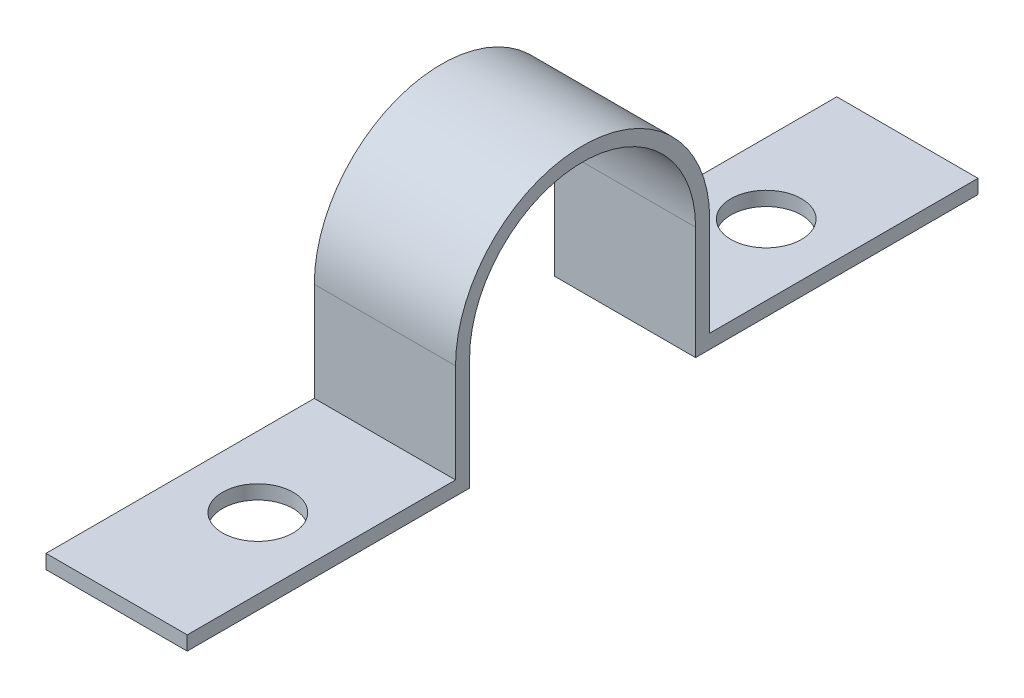
ISO-10303-21;
HEADER;
FILE_DESCRIPTION(('STEP AP214'),'2;1');
FILE_NAME('part.step','',(''),(''),'','','');
FILE_SCHEMA(('AUTOMOTIVE_DESIGN { 1 0 10303 214 1 1 1 1 }'));
ENDSEC;
DATA;
#1=APPLICATION_CONTEXT('core data for automotive mechanical design processes');
#2=APPLICATION_PROTOCOL_DEFINITION('international standard','automotive_design',2000,#1);
#3=PRODUCT_CONTEXT('',#1,'mechanical');
#4=PRODUCT('Part','Part','',(#3));
#5=PRODUCT_RELATED_PRODUCT_CATEGORY('part','',(#4));
#6=PRODUCT_DEFINITION_FORMATION('','',#4);
#7=PRODUCT_DEFINITION_CONTEXT('part definition',#1,'design');
#8=PRODUCT_DEFINITION('design','',#6,#7);
#9=PRODUCT_DEFINITION_SHAPE('','',#8);
#10=(LENGTH_UNIT() NAMED_UNIT(*) SI_UNIT(.MILLI.,.METRE.));
#11=(NAMED_UNIT(*) PLANE_ANGLE_UNIT() SI_UNIT($,.RADIAN.));
#12=(NAMED_UNIT(*) SI_UNIT($,.STERADIAN.) SOLID_ANGLE_UNIT());
#13=UNCERTAINTY_MEASURE_WITH_UNIT(LENGTH_MEASURE(1.E-05),#10,'distance_accuracy_value','');
#14=(GEOMETRIC_REPRESENTATION_CONTEXT(3) GLOBAL_UNCERTAINTY_ASSIGNED_CONTEXT((#13)) GLOBAL_UNIT_ASSIGNED_CONTEXT((#10,
#11,#12)) REPRESENTATION_CONTEXT('',''));
#15=CARTESIAN_POINT('',(0.,0.,0.));
#16=DIRECTION('',(0.,0.,1.));
#17=DIRECTION('',(1.,0.,0.));
#18=AXIS2_PLACEMENT_3D('',#15,#16,#17);
#19=CARTESIAN_POINT('',(10.,-7.,28.));
#20=DIRECTION('',(0.,0.,-1.));
#21=DIRECTION('',(-1.,0.,0.));
#22=AXIS2_PLACEMENT_3D('',#19,#20,#21);
#23=PLANE('',#22);
#24=DIRECTION('',(0.,-1.,0.));
#25=VECTOR('',#24,1.);
#26=CARTESIAN_POINT('',(0.,-7.,28.));
#27=LINE('',#26,#25);
#28=CARTESIAN_POINT('',(0.,-7.,28.));
#29=VERTEX_POINT('',#28);
#30=CARTESIAN_POINT('',(0.,-8.,28.));
#31=VERTEX_POINT('',#30);
#32=EDGE_CURVE('E153',#29,#31,#27,.T.);
#33=ORIENTED_EDGE('',*,*,#32,.T.);
#34=DIRECTION('',(-1.,0.,0.));
#35=VECTOR('',#34,1.);
#36=CARTESIAN_POINT('',(10.,-8.,28.));
#37=LINE('',#36,#35);
#38=CARTESIAN_POINT('',(10.,-8.,28.));
#39=VERTEX_POINT('',#38);
#40=EDGE_CURVE('E11',#39,#31,#37,.T.);
#41=ORIENTED_EDGE('',*,*,#40,.F.);
#42=DIRECTION('',(0.,-1.,0.));
#43=VECTOR('',#42,1.);
#44=CARTESIAN_POINT('',(10.,-7.,28.));
#45=LINE('',#44,#43);
#46=CARTESIAN_POINT('',(10.,-7.,28.));
#47=VERTEX_POINT('',#46);
#48=EDGE_CURVE('E176',#47,#39,#45,.T.);
#49=ORIENTED_EDGE('',*,*,#48,.F.);
#50=DIRECTION('',(-1.,0.,0.));
#51=VECTOR('',#50,1.);
#52=CARTESIAN_POINT('',(10.,-7.,28.));
#53=LINE('',#52,#51);
#54=EDGE_CURVE('E149',#47,#29,#53,.T.);
#55=ORIENTED_EDGE('',*,*,#54,.T.);
#56=EDGE_LOOP('',(#33,#41,#49,#55));
#57=FACE_BOUND('',#56,.T.);
#58=ADVANCED_FACE('F33',(#57),#23,.F.);
#59=CARTESIAN_POINT('',(10.,-8.,28.));
#60=DIRECTION('',(0.,1.,0.));
#61=DIRECTION('',(0.,0.,1.));
#62=AXIS2_PLACEMENT_3D('',#59,#60,#61);
#63=PLANE('',#62);
#64=CARTESIAN_POINT('',(5.,-8.,18.));
#65=DIRECTION('',(0.,1.,0.));
#66=DIRECTION('',(0.,0.,1.));
#67=AXIS2_PLACEMENT_3D('',#64,#65,#66);
#68=CIRCLE('',#67,2.49999999999999);
#69=CARTESIAN_POINT('',(5.,-8.,20.5));
#70=VERTEX_POINT('',#69);
#71=EDGE_CURVE('E359',#70,#70,#68,.T.);
#72=ORIENTED_EDGE('',*,*,#71,.T.);
#73=EDGE_LOOP('',(#72));
#74=FACE_BOUND('',#73,.T.);
#75=DIRECTION('',(0.,0.,-1.));
#76=VECTOR('',#75,1.);
#77=CARTESIAN_POINT('',(0.,-8.,28.));
#78=LINE('',#77,#76);
#79=CARTESIAN_POINT('',(0.,-8.,8.));
#80=VERTEX_POINT('',#79);
#81=EDGE_CURVE('E156',#31,#80,#78,.T.);
#82=ORIENTED_EDGE('',*,*,#81,.T.);
#83=DIRECTION('',(-1.,0.,0.));
#84=VECTOR('',#83,1.);
#85=CARTESIAN_POINT('',(10.,-8.,8.));
#86=LINE('',#85,#84);
#87=CARTESIAN_POINT('',(10.,-8.,8.));
#88=VERTEX_POINT('',#87);
#89=EDGE_CURVE('E41',#88,#80,#86,.T.);
#90=ORIENTED_EDGE('',*,*,#89,.F.);
#91=DIRECTION('',(0.,0.,-1.));
#92=VECTOR('',#91,1.);
#93=CARTESIAN_POINT('',(10.,-8.,28.));
#94=LINE('',#93,#92);
#95=EDGE_CURVE('E104',#39,#88,#94,.T.);
#96=ORIENTED_EDGE('',*,*,#95,.F.);
#97=ORIENTED_EDGE('',*,*,#40,.T.);
#98=EDGE_LOOP('',(#82,#90,#96,#97));
#99=FACE_BOUND('',#98,.T.);
#100=ADVANCED_FACE('F256',(#74,#99),#63,.F.);
#101=CARTESIAN_POINT('',(10.,0.,8.));
#102=DIRECTION('',(0.,0.,1.));
#103=DIRECTION('',(1.,0.,0.));
#104=AXIS2_PLACEMENT_3D('',#101,#102,#103);
#105=PLANE('',#104);
#106=DIRECTION('',(0.,1.,0.));
#107=VECTOR('',#106,1.);
#108=CARTESIAN_POINT('',(0.,0.,8.));
#109=LINE('',#108,#107);
#110=CARTESIAN_POINT('',(0.,0.,8.));
#111=VERTEX_POINT('',#110);
#112=EDGE_CURVE('E159',#80,#111,#109,.T.);
#113=ORIENTED_EDGE('',*,*,#112,.T.);
#114=DIRECTION('',(-1.,0.,0.));
#115=VECTOR('',#114,1.);
#116=CARTESIAN_POINT('',(10.,0.,8.));
#117=LINE('',#116,#115);
#118=CARTESIAN_POINT('',(10.,0.,8.));
#119=VERTEX_POINT('',#118);
#120=EDGE_CURVE('E195',#119,#111,#117,.T.);
#121=ORIENTED_EDGE('',*,*,#120,.F.);
#122=DIRECTION('',(0.,1.,0.));
#123=VECTOR('',#122,1.);
#124=CARTESIAN_POINT('',(10.,0.,8.));
#125=LINE('',#124,#123);
#126=EDGE_CURVE('E203',#88,#119,#125,.T.);
#127=ORIENTED_EDGE('',*,*,#126,.F.);
#128=ORIENTED_EDGE('',*,*,#89,.T.);
#129=EDGE_LOOP('',(#113,#121,#127,#128));
#130=FACE_BOUND('',#129,.T.);
#131=ADVANCED_FACE('F201',(#130),#105,.F.);
#132=CARTESIAN_POINT('',(10.,0.,0.));
#133=DIRECTION('',(-1.,0.,0.));
#134=DIRECTION('',(0.,0.,1.));
#135=AXIS2_PLACEMENT_3D('',#132,#133,#134);
#136=CYLINDRICAL_SURFACE('',#135,8.);
#137=CARTESIAN_POINT('',(0.,0.,0.));
#138=DIRECTION('',(-1.,0.,0.));
#139=DIRECTION('',(0.,0.,-1.));
#140=AXIS2_PLACEMENT_3D('',#137,#138,#139);
#141=CIRCLE('',#140,8.);
#142=CARTESIAN_POINT('',(0.,0.,-8.));
#143=VERTEX_POINT('',#142);
#144=EDGE_CURVE('E161',#111,#143,#141,.T.);
#145=ORIENTED_EDGE('',*,*,#144,.T.);
#146=DIRECTION('',(-1.,0.,0.));
#147=VECTOR('',#146,1.);
#148=CARTESIAN_POINT('',(10.,0.,-8.));
#149=LINE('',#148,#147);
#150=CARTESIAN_POINT('',(10.,0.,-8.));
#151=VERTEX_POINT('',#150);
#152=EDGE_CURVE('E192',#151,#143,#149,.T.);
#153=ORIENTED_EDGE('',*,*,#152,.F.);
#154=CARTESIAN_POINT('',(10.,0.,0.));
#155=DIRECTION('',(-1.,0.,0.));
#156=DIRECTION('',(0.,0.,-1.));
#157=AXIS2_PLACEMENT_3D('',#154,#155,#156);
#158=CIRCLE('',#157,8.);
#159=EDGE_CURVE('E221',#119,#151,#158,.T.);
#160=ORIENTED_EDGE('',*,*,#159,.F.);
#161=ORIENTED_EDGE('',*,*,#120,.T.);
#162=EDGE_LOOP('',(#145,#153,#160,#161));
#163=FACE_BOUND('',#162,.T.);
#164=ADVANCED_FACE('F212',(#163),#136,.F.);
#165=CARTESIAN_POINT('',(10.,0.,-8.));
#166=DIRECTION('',(0.,0.,-1.));
#167=DIRECTION('',(-1.,0.,0.));
#168=AXIS2_PLACEMENT_3D('',#165,#166,#167);
#169=PLANE('',#168);
#170=DIRECTION('',(0.,-1.,0.));
#171=VECTOR('',#170,1.);
#172=CARTESIAN_POINT('',(0.,0.,-8.));
#173=LINE('',#172,#171);
#174=CARTESIAN_POINT('',(0.,-8.,-8.));
#175=VERTEX_POINT('',#174);
#176=EDGE_CURVE('E163',#143,#175,#173,.T.);
#177=ORIENTED_EDGE('',*,*,#176,.T.);
#178=DIRECTION('',(-1.,0.,0.));
#179=VECTOR('',#178,1.);
#180=CARTESIAN_POINT('',(10.,-8.,-8.));
#181=LINE('',#180,#179);
#182=CARTESIAN_POINT('',(10.,-8.,-8.));
#183=VERTEX_POINT('',#182);
#184=EDGE_CURVE('E189',#183,#175,#181,.T.);
#185=ORIENTED_EDGE('',*,*,#184,.F.);
#186=DIRECTION('',(0.,-1.,0.));
#187=VECTOR('',#186,1.);
#188=CARTESIAN_POINT('',(10.,0.,-8.));
#189=LINE('',#188,#187);
#190=EDGE_CURVE('E218',#151,#183,#189,.T.);
#191=ORIENTED_EDGE('',*,*,#190,.F.);
#192=ORIENTED_EDGE('',*,*,#152,.T.);
#193=EDGE_LOOP('',(#177,#185,#191,#192));
#194=FACE_BOUND('',#193,.T.);
#195=ADVANCED_FACE('F216',(#194),#169,.F.);
#196=CARTESIAN_POINT('',(10.,-8.,-8.));
#197=DIRECTION('',(0.,1.,0.));
#198=DIRECTION('',(0.,0.,1.));
#199=AXIS2_PLACEMENT_3D('',#196,#197,#198);
#200=PLANE('',#199);
#201=CARTESIAN_POINT('',(5.,-8.,-18.));
#202=DIRECTION('',(0.,1.,0.));
#203=DIRECTION('',(0.,0.,1.));
#204=AXIS2_PLACEMENT_3D('',#201,#202,#203);
#205=CIRCLE('',#204,2.49999999999999);
#206=CARTESIAN_POINT('',(5.,-8.,-15.5));
#207=VERTEX_POINT('',#206);
#208=EDGE_CURVE('E157',#207,#207,#205,.T.);
#209=ORIENTED_EDGE('',*,*,#208,.T.);
#210=EDGE_LOOP('',(#209));
#211=FACE_BOUND('',#210,.T.);
#212=DIRECTION('',(0.,0.,-1.));
#213=VECTOR('',#212,1.);
#214=CARTESIAN_POINT('',(0.,-8.,-8.));
#215=LINE('',#214,#213);
#216=CARTESIAN_POINT('',(0.,-8.,-28.));
#217=VERTEX_POINT('',#216);
#218=EDGE_CURVE('E165',#175,#217,#215,.T.);
#219=ORIENTED_EDGE('',*,*,#218,.T.);
#220=DIRECTION('',(-1.,0.,0.));
#221=VECTOR('',#220,1.);
#222=CARTESIAN_POINT('',(10.,-8.,-28.));
#223=LINE('',#222,#221);
#224=CARTESIAN_POINT('',(10.,-8.,-28.));
#225=VERTEX_POINT('',#224);
#226=EDGE_CURVE('E186',#225,#217,#223,.T.);
#227=ORIENTED_EDGE('',*,*,#226,.F.);
#228=DIRECTION('',(0.,0.,-1.));
#229=VECTOR('',#228,1.);
#230=CARTESIAN_POINT('',(10.,-8.,-8.));
#231=LINE('',#230,#229);
#232=EDGE_CURVE('E220',#183,#225,#231,.T.);
#233=ORIENTED_EDGE('',*,*,#232,.F.);
#234=ORIENTED_EDGE('',*,*,#184,.T.);
#235=EDGE_LOOP('',(#219,#227,#233,#234));
#236=FACE_BOUND('',#235,.T.);
#237=ADVANCED_FACE('F271',(#211,#236),#200,.F.);
#238=CARTESIAN_POINT('',(10.,-7.,-28.));
#239=DIRECTION('',(0.,0.,1.));
#240=DIRECTION('',(1.,0.,0.));
#241=AXIS2_PLACEMENT_3D('',#238,#239,#240);
#242=PLANE('',#241);
#243=DIRECTION('',(0.,1.,0.));
#244=VECTOR('',#243,1.);
#245=CARTESIAN_POINT('',(0.,-7.,-28.));
#246=LINE('',#245,#244);
#247=CARTESIAN_POINT('',(0.,-7.,-28.));
#248=VERTEX_POINT('',#247);
#249=EDGE_CURVE('E167',#217,#248,#246,.T.);
#250=ORIENTED_EDGE('',*,*,#249,.T.);
#251=DIRECTION('',(-1.,0.,0.));
#252=VECTOR('',#251,1.);
#253=CARTESIAN_POINT('',(10.,-7.,-28.));
#254=LINE('',#253,#252);
#255=CARTESIAN_POINT('',(10.,-7.,-28.));
#256=VERTEX_POINT('',#255);
#257=EDGE_CURVE('E183',#256,#248,#254,.T.);
#258=ORIENTED_EDGE('',*,*,#257,.F.);
#259=DIRECTION('',(0.,1.,0.));
#260=VECTOR('',#259,1.);
#261=CARTESIAN_POINT('',(10.,-7.,-28.));
#262=LINE('',#261,#260);
#263=EDGE_CURVE('E223',#225,#256,#262,.T.);
#264=ORIENTED_EDGE('',*,*,#263,.F.);
#265=ORIENTED_EDGE('',*,*,#226,.T.);
#266=EDGE_LOOP('',(#250,#258,#264,#265));
#267=FACE_BOUND('',#266,.T.);
#268=ADVANCED_FACE('F274',(#267),#242,.F.);
#269=CARTESIAN_POINT('',(10.,-7.,-9.));
#270=DIRECTION('',(0.,-1.,0.));
#271=DIRECTION('',(0.,0.,-1.));
#272=AXIS2_PLACEMENT_3D('',#269,#270,#271);
#273=PLANE('',#272);
#274=CARTESIAN_POINT('',(5.,-7.,-18.));
#275=DIRECTION('',(0.,1.,0.));
#276=DIRECTION('',(0.,0.,1.));
#277=AXIS2_PLACEMENT_3D('',#274,#275,#276);
#278=CIRCLE('',#277,2.49999999999999);
#279=CARTESIAN_POINT('',(5.,-7.,-15.5));
#280=VERTEX_POINT('',#279);
#281=EDGE_CURVE('E360',#280,#280,#278,.T.);
#282=ORIENTED_EDGE('',*,*,#281,.F.);
#283=EDGE_LOOP('',(#282));
#284=FACE_BOUND('',#283,.T.);
#285=DIRECTION('',(0.,0.,1.));
#286=VECTOR('',#285,1.);
#287=CARTESIAN_POINT('',(0.,-7.,-9.));
#288=LINE('',#287,#286);
#289=CARTESIAN_POINT('',(0.,-7.,-9.));
#290=VERTEX_POINT('',#289);
#291=EDGE_CURVE('E169',#248,#290,#288,.T.);
#292=ORIENTED_EDGE('',*,*,#291,.T.);
#293=DIRECTION('',(-1.,0.,0.));
#294=VECTOR('',#293,1.);
#295=CARTESIAN_POINT('',(10.,-7.,-9.));
#296=LINE('',#295,#294);
#297=CARTESIAN_POINT('',(10.,-7.,-9.));
#298=VERTEX_POINT('',#297);
#299=EDGE_CURVE('E180',#298,#290,#296,.T.);
#300=ORIENTED_EDGE('',*,*,#299,.F.);
#301=DIRECTION('',(0.,0.,1.));
#302=VECTOR('',#301,1.);
#303=CARTESIAN_POINT('',(10.,-7.,-9.));
#304=LINE('',#303,#302);
#305=EDGE_CURVE('E229',#256,#298,#304,.T.);
#306=ORIENTED_EDGE('',*,*,#305,.F.);
#307=ORIENTED_EDGE('',*,*,#257,.T.);
#308=EDGE_LOOP('',(#292,#300,#306,#307));
#309=FACE_BOUND('',#308,.T.);
#310=ADVANCED_FACE('F235',(#284,#309),#273,.F.);
#311=CARTESIAN_POINT('',(10.,0.,-9.));
#312=DIRECTION('',(0.,0.,1.));
#313=DIRECTION('',(1.,0.,0.));
#314=AXIS2_PLACEMENT_3D('',#311,#312,#313);
#315=PLANE('',#314);
#316=DIRECTION('',(0.,1.,0.));
#317=VECTOR('',#316,1.);
#318=CARTESIAN_POINT('',(0.,0.,-9.));
#319=LINE('',#318,#317);
#320=CARTESIAN_POINT('',(0.,0.,-9.));
#321=VERTEX_POINT('',#320);
#322=EDGE_CURVE('E171',#290,#321,#319,.T.);
#323=ORIENTED_EDGE('',*,*,#322,.T.);
#324=DIRECTION('',(-1.,0.,0.));
#325=VECTOR('',#324,1.);
#326=CARTESIAN_POINT('',(10.,0.,-9.));
#327=LINE('',#326,#325);
#328=CARTESIAN_POINT('',(10.,0.,-9.));
#329=VERTEX_POINT('',#328);
#330=EDGE_CURVE('E144',#329,#321,#327,.T.);
#331=ORIENTED_EDGE('',*,*,#330,.F.);
#332=DIRECTION('',(0.,1.,0.));
#333=VECTOR('',#332,1.);
#334=CARTESIAN_POINT('',(10.,0.,-9.));
#335=LINE('',#334,#333);
#336=EDGE_CURVE('E135',#298,#329,#335,.T.);
#337=ORIENTED_EDGE('',*,*,#336,.F.);
#338=ORIENTED_EDGE('',*,*,#299,.T.);
#339=EDGE_LOOP('',(#323,#331,#337,#338));
#340=FACE_BOUND('',#339,.T.);
#341=ADVANCED_FACE('F239',(#340),#315,.F.);
#342=CARTESIAN_POINT('',(10.,0.,0.));
#343=DIRECTION('',(-1.,0.,0.));
#344=DIRECTION('',(0.,0.,1.));
#345=AXIS2_PLACEMENT_3D('',#342,#343,#344);
#346=CYLINDRICAL_SURFACE('',#345,9.);
#347=CARTESIAN_POINT('',(0.,0.,0.));
#348=DIRECTION('',(1.,0.,0.));
#349=DIRECTION('',(0.,0.,-1.));
#350=AXIS2_PLACEMENT_3D('',#347,#348,#349);
#351=CIRCLE('',#350,9.);
#352=CARTESIAN_POINT('',(0.,0.,9.));
#353=VERTEX_POINT('',#352);
#354=EDGE_CURVE('E143',#321,#353,#351,.T.);
#355=ORIENTED_EDGE('',*,*,#354,.T.);
#356=DIRECTION('',(-1.,0.,0.));
#357=VECTOR('',#356,1.);
#358=CARTESIAN_POINT('',(10.,0.,9.));
#359=LINE('',#358,#357);
#360=CARTESIAN_POINT('',(10.,0.,9.));
#361=VERTEX_POINT('',#360);
#362=EDGE_CURVE('E140',#361,#353,#359,.T.);
#363=ORIENTED_EDGE('',*,*,#362,.F.);
#364=CARTESIAN_POINT('',(10.,0.,0.));
#365=DIRECTION('',(1.,0.,0.));
#366=DIRECTION('',(0.,0.,-1.));
#367=AXIS2_PLACEMENT_3D('',#364,#365,#366);
#368=CIRCLE('',#367,9.);
#369=EDGE_CURVE('E129',#329,#361,#368,.T.);
#370=ORIENTED_EDGE('',*,*,#369,.F.);
#371=ORIENTED_EDGE('',*,*,#330,.T.);
#372=EDGE_LOOP('',(#355,#363,#370,#371));
#373=FACE_BOUND('',#372,.T.);
#374=ADVANCED_FACE('F141',(#373),#346,.T.);
#375=CARTESIAN_POINT('',(10.,0.,9.));
#376=DIRECTION('',(0.,0.,-1.));
#377=DIRECTION('',(-1.,0.,0.));
#378=AXIS2_PLACEMENT_3D('',#375,#376,#377);
#379=PLANE('',#378);
#380=DIRECTION('',(0.,-1.,0.));
#381=VECTOR('',#380,1.);
#382=CARTESIAN_POINT('',(0.,0.,9.));
#383=LINE('',#382,#381);
#384=CARTESIAN_POINT('',(0.,-7.,9.));
#385=VERTEX_POINT('',#384);
#386=EDGE_CURVE('E90',#353,#385,#383,.T.);
#387=ORIENTED_EDGE('',*,*,#386,.T.);
#388=DIRECTION('',(-1.,0.,0.));
#389=VECTOR('',#388,1.);
#390=CARTESIAN_POINT('',(10.,-7.,9.));
#391=LINE('',#390,#389);
#392=CARTESIAN_POINT('',(10.,-7.,9.));
#393=VERTEX_POINT('',#392);
#394=EDGE_CURVE('E145',#393,#385,#391,.T.);
#395=ORIENTED_EDGE('',*,*,#394,.F.);
#396=DIRECTION('',(0.,-1.,0.));
#397=VECTOR('',#396,1.);
#398=CARTESIAN_POINT('',(10.,0.,9.));
#399=LINE('',#398,#397);
#400=EDGE_CURVE('E133',#361,#393,#399,.T.);
#401=ORIENTED_EDGE('',*,*,#400,.F.);
#402=ORIENTED_EDGE('',*,*,#362,.T.);
#403=EDGE_LOOP('',(#387,#395,#401,#402));
#404=FACE_BOUND('',#403,.T.);
#405=ADVANCED_FACE('F147',(#404),#379,.F.);
#406=CARTESIAN_POINT('',(10.,-7.,28.));
#407=DIRECTION('',(0.,-1.,0.));
#408=DIRECTION('',(0.,0.,-1.));
#409=AXIS2_PLACEMENT_3D('',#406,#407,#408);
#410=PLANE('',#409);
#411=CARTESIAN_POINT('',(5.,-7.,18.));
#412=DIRECTION('',(0.,1.,0.));
#413=DIRECTION('',(0.,0.,1.));
#414=AXIS2_PLACEMENT_3D('',#411,#412,#413);
#415=CIRCLE('',#414,2.49999999999999);
#416=CARTESIAN_POINT('',(5.,-7.,20.5));
#417=VERTEX_POINT('',#416);
#418=EDGE_CURVE('E357',#417,#417,#415,.T.);
#419=ORIENTED_EDGE('',*,*,#418,.F.);
#420=EDGE_LOOP('',(#419));
#421=FACE_BOUND('',#420,.T.);
#422=DIRECTION('',(0.,0.,1.));
#423=VECTOR('',#422,1.);
#424=CARTESIAN_POINT('',(0.,-7.,28.));
#425=LINE('',#424,#423);
#426=EDGE_CURVE('E96',#385,#29,#425,.T.);
#427=ORIENTED_EDGE('',*,*,#426,.T.);
#428=ORIENTED_EDGE('',*,*,#54,.F.);
#429=DIRECTION('',(0.,0.,1.));
#430=VECTOR('',#429,1.);
#431=CARTESIAN_POINT('',(10.,-7.,28.));
#432=LINE('',#431,#430);
#433=EDGE_CURVE('E49',#393,#47,#432,.T.);
#434=ORIENTED_EDGE('',*,*,#433,.F.);
#435=ORIENTED_EDGE('',*,*,#394,.T.);
#436=EDGE_LOOP('',(#427,#428,#434,#435));
#437=FACE_BOUND('',#436,.T.);
#438=ADVANCED_FACE('F243',(#421,#437),#410,.F.);
#439=CARTESIAN_POINT('',(10.,0.,0.));
#440=DIRECTION('',(1.,0.,0.));
#441=DIRECTION('',(0.,0.,-1.));
#442=AXIS2_PLACEMENT_3D('',#439,#440,#441);
#443=PLANE('',#442);
#444=ORIENTED_EDGE('',*,*,#48,.T.);
#445=ORIENTED_EDGE('',*,*,#95,.T.);
#446=ORIENTED_EDGE('',*,*,#126,.T.);
#447=ORIENTED_EDGE('',*,*,#159,.T.);
#448=ORIENTED_EDGE('',*,*,#190,.T.);
#449=ORIENTED_EDGE('',*,*,#232,.T.);
#450=ORIENTED_EDGE('',*,*,#263,.T.);
#451=ORIENTED_EDGE('',*,*,#305,.T.);
#452=ORIENTED_EDGE('',*,*,#336,.T.);
#453=ORIENTED_EDGE('',*,*,#369,.T.);
#454=ORIENTED_EDGE('',*,*,#400,.T.);
#455=ORIENTED_EDGE('',*,*,#433,.T.);
#456=EDGE_LOOP('',(#444,#445,#446,#447,#448,#449,#450,#451,#452,#453,#454,#455));
#457=FACE_BOUND('',#456,.T.);
#458=ADVANCED_FACE('F131',(#457),#443,.T.);
#459=CARTESIAN_POINT('',(0.,0.,0.));
#460=DIRECTION('',(1.,0.,0.));
#461=DIRECTION('',(0.,0.,-1.));
#462=AXIS2_PLACEMENT_3D('',#459,#460,#461);
#463=PLANE('',#462);
#464=ORIENTED_EDGE('',*,*,#32,.F.);
#465=ORIENTED_EDGE('',*,*,#426,.F.);
#466=ORIENTED_EDGE('',*,*,#386,.F.);
#467=ORIENTED_EDGE('',*,*,#354,.F.);
#468=ORIENTED_EDGE('',*,*,#322,.F.);
#469=ORIENTED_EDGE('',*,*,#291,.F.);
#470=ORIENTED_EDGE('',*,*,#249,.F.);
#471=ORIENTED_EDGE('',*,*,#218,.F.);
#472=ORIENTED_EDGE('',*,*,#176,.F.);
#473=ORIENTED_EDGE('',*,*,#144,.F.);
#474=ORIENTED_EDGE('',*,*,#112,.F.);
#475=ORIENTED_EDGE('',*,*,#81,.F.);
#476=EDGE_LOOP('',(#464,#465,#466,#467,#468,#469,#470,#471,#472,#473,#474,#475));
#477=FACE_BOUND('',#476,.T.);
#478=ADVANCED_FACE('F207',(#477),#463,.F.);
#479=CARTESIAN_POINT('',(5.,-7.,-18.));
#480=DIRECTION('',(0.,1.,0.));
#481=DIRECTION('',(0.,0.,1.));
#482=AXIS2_PLACEMENT_3D('',#479,#480,#481);
#483=CYLINDRICAL_SURFACE('',#482,2.49999999999999);
#484=ORIENTED_EDGE('',*,*,#281,.T.);
#485=EDGE_LOOP('',(#484));
#486=FACE_BOUND('',#485,.T.);
#487=ORIENTED_EDGE('',*,*,#208,.F.);
#488=EDGE_LOOP('',(#487));
#489=FACE_BOUND('',#488,.T.);
#490=ADVANCED_FACE('F309',(#486,#489),#483,.F.);
#491=CARTESIAN_POINT('',(5.,-7.,18.));
#492=DIRECTION('',(0.,1.,0.));
#493=DIRECTION('',(0.,0.,1.));
#494=AXIS2_PLACEMENT_3D('',#491,#492,#493);
#495=CYLINDRICAL_SURFACE('',#494,2.49999999999999);
#496=ORIENTED_EDGE('',*,*,#418,.T.);
#497=EDGE_LOOP('',(#496));
#498=FACE_BOUND('',#497,.T.);
#499=ORIENTED_EDGE('',*,*,#71,.F.);
#500=EDGE_LOOP('',(#499));
#501=FACE_BOUND('',#500,.T.);
#502=ADVANCED_FACE('F331',(#498,#501),#495,.F.);
#503=CLOSED_SHELL('',(#58,#100,#131,#164,#195,#237,#268,#310,#341,#374,#405,#438,#458,#478,#490,#502));
#504=MANIFOLD_SOLID_BREP('B2',#503);
#505=ADVANCED_BREP_SHAPE_REPRESENTATION('',(#18,#504),#14);
#506=SHAPE_DEFINITION_REPRESENTATION(#9,#505);
ENDSEC;
END-ISO-10303-21;
